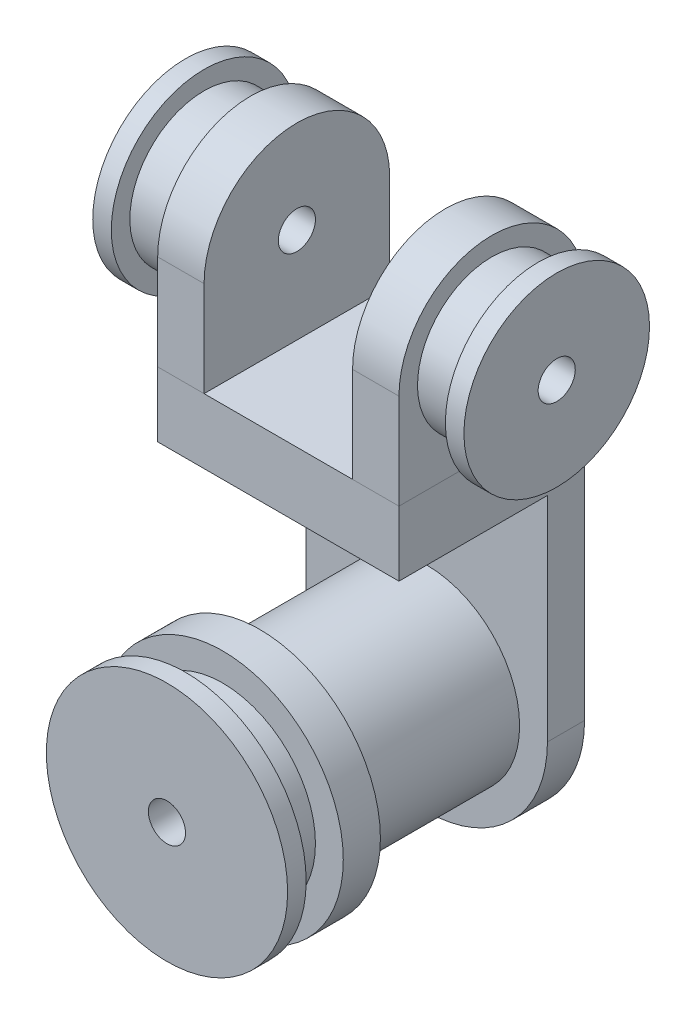
ISO-10303-21;
HEADER;
FILE_DESCRIPTION(('STEP AP214'),'2;1');
FILE_NAME('part.step','',(''),(''),'','','');
FILE_SCHEMA(('AUTOMOTIVE_DESIGN { 1 0 10303 214 1 1 1 1 }'));
ENDSEC;
DATA;
#1=APPLICATION_CONTEXT('core data for automotive mechanical design processes');
#2=APPLICATION_PROTOCOL_DEFINITION('international standard','automotive_design',2000,#1);
#3=PRODUCT_CONTEXT('',#1,'mechanical');
#4=PRODUCT('Part','Part','',(#3));
#5=PRODUCT_RELATED_PRODUCT_CATEGORY('part','',(#4));
#6=PRODUCT_DEFINITION_FORMATION('','',#4);
#7=PRODUCT_DEFINITION_CONTEXT('part definition',#1,'design');
#8=PRODUCT_DEFINITION('design','',#6,#7);
#9=PRODUCT_DEFINITION_SHAPE('','',#8);
#10=(LENGTH_UNIT() NAMED_UNIT(*) SI_UNIT(.MILLI.,.METRE.));
#11=(NAMED_UNIT(*) PLANE_ANGLE_UNIT() SI_UNIT($,.RADIAN.));
#12=(NAMED_UNIT(*) SI_UNIT($,.STERADIAN.) SOLID_ANGLE_UNIT());
#13=UNCERTAINTY_MEASURE_WITH_UNIT(LENGTH_MEASURE(1.E-05),#10,'distance_accuracy_value','');
#14=(GEOMETRIC_REPRESENTATION_CONTEXT(3) GLOBAL_UNCERTAINTY_ASSIGNED_CONTEXT((#13)) GLOBAL_UNIT_ASSIGNED_CONTEXT((#10,
#11,#12)) REPRESENTATION_CONTEXT('',''));
#15=CARTESIAN_POINT('',(0.,0.,0.));
#16=DIRECTION('',(0.,0.,1.));
#17=DIRECTION('',(1.,0.,0.));
#18=AXIS2_PLACEMENT_3D('',#15,#16,#17);
#19=CARTESIAN_POINT('',(-6.5,0.,0.));
#20=DIRECTION('',(-1.,0.,0.));
#21=DIRECTION('',(0.,1.,0.));
#22=AXIS2_PLACEMENT_3D('',#19,#20,#21);
#23=PLANE('',#22);
#24=DIRECTION('',(0.,1.,0.));
#25=VECTOR('',#24,1.);
#26=CARTESIAN_POINT('',(-6.5,0.,9.99999999999999));
#27=LINE('',#26,#25);
#28=CARTESIAN_POINT('',(-6.5,15.,10.));
#29=VERTEX_POINT('',#28);
#30=CARTESIAN_POINT('',(-6.5,20.1325517756622,10.));
#31=VERTEX_POINT('',#30);
#32=EDGE_CURVE('E115',#29,#31,#27,.T.);
#33=ORIENTED_EDGE('',*,*,#32,.T.);
#34=CARTESIAN_POINT('',(-6.5,20.1325517756622,5.));
#35=DIRECTION('',(1.,0.,0.));
#36=DIRECTION('',(0.,1.,0.));
#37=AXIS2_PLACEMENT_3D('',#34,#35,#36);
#38=CIRCLE('',#37,5.);
#39=CARTESIAN_POINT('',(-6.5,20.1325517756622,0.));
#40=VERTEX_POINT('',#39);
#41=EDGE_CURVE('E122',#40,#31,#38,.T.);
#42=ORIENTED_EDGE('',*,*,#41,.F.);
#43=DIRECTION('',(0.,1.,0.));
#44=VECTOR('',#43,1.);
#45=CARTESIAN_POINT('',(-6.5,0.,0.));
#46=LINE('',#45,#44);
#47=CARTESIAN_POINT('',(-6.5,15.,0.));
#48=VERTEX_POINT('',#47);
#49=EDGE_CURVE('E120',#48,#40,#46,.T.);
#50=ORIENTED_EDGE('',*,*,#49,.F.);
#51=DIRECTION('',(0.,0.,1.));
#52=VECTOR('',#51,1.);
#53=CARTESIAN_POINT('',(-6.5,15.,0.));
#54=LINE('',#53,#52);
#55=EDGE_CURVE('E104',#48,#29,#54,.T.);
#56=ORIENTED_EDGE('',*,*,#55,.T.);
#57=EDGE_LOOP('',(#33,#42,#50,#56));
#58=FACE_BOUND('',#57,.T.);
#59=CARTESIAN_POINT('',(-6.5,20.1325517756622,5.));
#60=DIRECTION('',(1.,0.,0.));
#61=DIRECTION('',(0.,1.,0.));
#62=AXIS2_PLACEMENT_3D('',#59,#60,#61);
#63=CIRCLE('',#62,4.);
#64=CARTESIAN_POINT('',(-6.5,24.1325517756622,5.));
#65=VERTEX_POINT('',#64);
#66=EDGE_CURVE('E126',#65,#65,#63,.T.);
#67=ORIENTED_EDGE('',*,*,#66,.T.);
#68=EDGE_LOOP('',(#67));
#69=FACE_BOUND('',#68,.T.);
#70=ADVANCED_FACE('F47',(#58,#69),#23,.T.);
#71=CARTESIAN_POINT('',(-4.,0.,9.99999999999999));
#72=DIRECTION('',(0.,0.,-1.));
#73=DIRECTION('',(0.,1.,0.));
#74=AXIS2_PLACEMENT_3D('',#71,#72,#73);
#75=PLANE('',#74);
#76=ORIENTED_EDGE('',*,*,#32,.F.);
#77=DIRECTION('',(-1.,0.,0.));
#78=VECTOR('',#77,1.);
#79=CARTESIAN_POINT('',(-4.,15.,10.));
#80=LINE('',#79,#78);
#81=CARTESIAN_POINT('',(-4.,15.,10.));
#82=VERTEX_POINT('',#81);
#83=EDGE_CURVE('E51',#82,#29,#80,.T.);
#84=ORIENTED_EDGE('',*,*,#83,.F.);
#85=DIRECTION('',(0.,1.,0.));
#86=VECTOR('',#85,1.);
#87=CARTESIAN_POINT('',(-4.,0.,9.99999999999999));
#88=LINE('',#87,#86);
#89=CARTESIAN_POINT('',(-4.,20.1325517756622,10.));
#90=VERTEX_POINT('',#89);
#91=EDGE_CURVE('E97',#82,#90,#88,.T.);
#92=ORIENTED_EDGE('',*,*,#91,.T.);
#93=DIRECTION('',(-1.,0.,0.));
#94=VECTOR('',#93,1.);
#95=CARTESIAN_POINT('',(-4.,20.1325517756622,10.));
#96=LINE('',#95,#94);
#97=EDGE_CURVE('E12',#90,#31,#96,.T.);
#98=ORIENTED_EDGE('',*,*,#97,.T.);
#99=EDGE_LOOP('',(#76,#84,#92,#98));
#100=FACE_BOUND('',#99,.T.);
#101=ADVANCED_FACE('F49',(#100),#75,.F.);
#102=CARTESIAN_POINT('',(-4.,20.1325517756622,5.));
#103=DIRECTION('',(-1.,0.,0.));
#104=DIRECTION('',(0.,1.,0.));
#105=AXIS2_PLACEMENT_3D('',#102,#103,#104);
#106=CYLINDRICAL_SURFACE('',#105,5.);
#107=ORIENTED_EDGE('',*,*,#41,.T.);
#108=ORIENTED_EDGE('',*,*,#97,.F.);
#109=CARTESIAN_POINT('',(-4.,20.1325517756622,5.));
#110=DIRECTION('',(1.,0.,0.));
#111=DIRECTION('',(0.,1.,0.));
#112=AXIS2_PLACEMENT_3D('',#109,#110,#111);
#113=CIRCLE('',#112,5.);
#114=CARTESIAN_POINT('',(-4.,20.1325517756622,0.));
#115=VERTEX_POINT('',#114);
#116=EDGE_CURVE('E66',#115,#90,#113,.T.);
#117=ORIENTED_EDGE('',*,*,#116,.F.);
#118=DIRECTION('',(-1.,0.,0.));
#119=VECTOR('',#118,1.);
#120=CARTESIAN_POINT('',(-4.,20.1325517756622,0.));
#121=LINE('',#120,#119);
#122=EDGE_CURVE('E57',#115,#40,#121,.T.);
#123=ORIENTED_EDGE('',*,*,#122,.T.);
#124=EDGE_LOOP('',(#107,#108,#117,#123));
#125=FACE_BOUND('',#124,.T.);
#126=ADVANCED_FACE('F160',(#125),#106,.T.);
#127=CARTESIAN_POINT('',(-4.,0.,0.));
#128=DIRECTION('',(0.,0.,-1.));
#129=DIRECTION('',(0.,1.,0.));
#130=AXIS2_PLACEMENT_3D('',#127,#128,#129);
#131=PLANE('',#130);
#132=ORIENTED_EDGE('',*,*,#49,.T.);
#133=ORIENTED_EDGE('',*,*,#122,.F.);
#134=DIRECTION('',(0.,1.,0.));
#135=VECTOR('',#134,1.);
#136=CARTESIAN_POINT('',(-4.,0.,0.));
#137=LINE('',#136,#135);
#138=CARTESIAN_POINT('',(-4.,15.,0.));
#139=VERTEX_POINT('',#138);
#140=EDGE_CURVE('E96',#139,#115,#137,.T.);
#141=ORIENTED_EDGE('',*,*,#140,.F.);
#142=DIRECTION('',(-1.,0.,0.));
#143=VECTOR('',#142,1.);
#144=CARTESIAN_POINT('',(-4.,15.,0.));
#145=LINE('',#144,#143);
#146=EDGE_CURVE('E101',#139,#48,#145,.T.);
#147=ORIENTED_EDGE('',*,*,#146,.T.);
#148=EDGE_LOOP('',(#132,#133,#141,#147));
#149=FACE_BOUND('',#148,.T.);
#150=ADVANCED_FACE('F107',(#149),#131,.T.);
#151=CARTESIAN_POINT('',(-4.,15.,0.));
#152=DIRECTION('',(0.,1.,0.));
#153=DIRECTION('',(1.,0.,0.));
#154=AXIS2_PLACEMENT_3D('',#151,#152,#153);
#155=PLANE('',#154);
#156=ORIENTED_EDGE('',*,*,#55,.F.);
#157=ORIENTED_EDGE('',*,*,#146,.F.);
#158=DIRECTION('',(0.,0.,1.));
#159=VECTOR('',#158,1.);
#160=CARTESIAN_POINT('',(-4.,15.,0.));
#161=LINE('',#160,#159);
#162=EDGE_CURVE('E92',#139,#82,#161,.T.);
#163=ORIENTED_EDGE('',*,*,#162,.T.);
#164=ORIENTED_EDGE('',*,*,#83,.T.);
#165=EDGE_LOOP('',(#156,#157,#163,#164));
#166=FACE_BOUND('',#165,.T.);
#167=ADVANCED_FACE('F102',(#166),#155,.F.);
#168=CARTESIAN_POINT('',(-4.,20.1325517756622,5.));
#169=DIRECTION('',(-1.,0.,0.));
#170=DIRECTION('',(0.,1.,0.));
#171=AXIS2_PLACEMENT_3D('',#168,#169,#170);
#172=CYLINDRICAL_SURFACE('',#171,1.);
#173=CARTESIAN_POINT('',(-4.,20.1325517756622,5.));
#174=DIRECTION('',(1.,0.,0.));
#175=DIRECTION('',(0.,1.,0.));
#176=AXIS2_PLACEMENT_3D('',#173,#174,#175);
#177=CIRCLE('',#176,1.);
#178=CARTESIAN_POINT('',(-4.,21.1325517756622,5.));
#179=VERTEX_POINT('',#178);
#180=EDGE_CURVE('E109',#179,#179,#177,.T.);
#181=ORIENTED_EDGE('',*,*,#180,.T.);
#182=EDGE_LOOP('',(#181));
#183=FACE_BOUND('',#182,.T.);
#184=CARTESIAN_POINT('',(-10.,20.1325517756622,5.));
#185=DIRECTION('',(1.,0.,0.));
#186=DIRECTION('',(0.,1.,0.));
#187=AXIS2_PLACEMENT_3D('',#184,#185,#186);
#188=CIRCLE('',#187,1.);
#189=CARTESIAN_POINT('',(-10.,21.1325517756622,5.));
#190=VERTEX_POINT('',#189);
#191=EDGE_CURVE('E135',#190,#190,#188,.T.);
#192=ORIENTED_EDGE('',*,*,#191,.F.);
#193=EDGE_LOOP('',(#192));
#194=FACE_BOUND('',#193,.T.);
#195=ADVANCED_FACE('F143',(#183,#194),#172,.F.);
#196=CARTESIAN_POINT('',(-4.,0.,0.));
#197=DIRECTION('',(-1.,0.,0.));
#198=DIRECTION('',(0.,1.,0.));
#199=AXIS2_PLACEMENT_3D('',#196,#197,#198);
#200=PLANE('',#199);
#201=ORIENTED_EDGE('',*,*,#91,.F.);
#202=ORIENTED_EDGE('',*,*,#162,.F.);
#203=ORIENTED_EDGE('',*,*,#140,.T.);
#204=ORIENTED_EDGE('',*,*,#116,.T.);
#205=EDGE_LOOP('',(#201,#202,#203,#204));
#206=FACE_BOUND('',#205,.T.);
#207=ORIENTED_EDGE('',*,*,#180,.F.);
#208=EDGE_LOOP('',(#207));
#209=FACE_BOUND('',#208,.T.);
#210=ADVANCED_FACE('F93',(#206,#209),#200,.F.);
#211=CARTESIAN_POINT('',(-9.,20.1325517756622,5.));
#212=DIRECTION('',(1.,0.,0.));
#213=DIRECTION('',(0.,-1.,0.));
#214=AXIS2_PLACEMENT_3D('',#211,#212,#213);
#215=CYLINDRICAL_SURFACE('',#214,4.);
#216=CARTESIAN_POINT('',(-9.,20.1325517756622,5.));
#217=DIRECTION('',(1.,0.,0.));
#218=DIRECTION('',(0.,1.,0.));
#219=AXIS2_PLACEMENT_3D('',#216,#217,#218);
#220=CIRCLE('',#219,4.);
#221=CARTESIAN_POINT('',(-9.,24.1325517756622,5.));
#222=VERTEX_POINT('',#221);
#223=EDGE_CURVE('E118',#222,#222,#220,.T.);
#224=ORIENTED_EDGE('',*,*,#223,.T.);
#225=EDGE_LOOP('',(#224));
#226=FACE_BOUND('',#225,.T.);
#227=ORIENTED_EDGE('',*,*,#66,.F.);
#228=EDGE_LOOP('',(#227));
#229=FACE_BOUND('',#228,.T.);
#230=ADVANCED_FACE('F151',(#226,#229),#215,.T.);
#231=CARTESIAN_POINT('',(-10.,20.1325517756622,5.));
#232=DIRECTION('',(-1.,0.,0.));
#233=DIRECTION('',(0.,1.,0.));
#234=AXIS2_PLACEMENT_3D('',#231,#232,#233);
#235=PLANE('',#234);
#236=CARTESIAN_POINT('',(-10.,20.1325517756622,5.));
#237=DIRECTION('',(1.,0.,0.));
#238=DIRECTION('',(0.,1.,0.));
#239=AXIS2_PLACEMENT_3D('',#236,#237,#238);
#240=CIRCLE('',#239,5.);
#241=CARTESIAN_POINT('',(-10.,25.1325517756622,5.));
#242=VERTEX_POINT('',#241);
#243=EDGE_CURVE('E129',#242,#242,#240,.T.);
#244=ORIENTED_EDGE('',*,*,#243,.F.);
#245=EDGE_LOOP('',(#244));
#246=FACE_BOUND('',#245,.T.);
#247=ORIENTED_EDGE('',*,*,#191,.T.);
#248=EDGE_LOOP('',(#247));
#249=FACE_BOUND('',#248,.T.);
#250=ADVANCED_FACE('F141',(#246,#249),#235,.T.);
#251=CARTESIAN_POINT('',(-9.,20.1325517756622,5.));
#252=DIRECTION('',(-1.,0.,0.));
#253=DIRECTION('',(0.,1.,0.));
#254=AXIS2_PLACEMENT_3D('',#251,#252,#253);
#255=PLANE('',#254);
#256=ORIENTED_EDGE('',*,*,#223,.F.);
#257=EDGE_LOOP('',(#256));
#258=FACE_BOUND('',#257,.T.);
#259=CARTESIAN_POINT('',(-9.,20.1325517756622,5.));
#260=DIRECTION('',(1.,0.,0.));
#261=DIRECTION('',(0.,1.,0.));
#262=AXIS2_PLACEMENT_3D('',#259,#260,#261);
#263=CIRCLE('',#262,5.);
#264=CARTESIAN_POINT('',(-9.,25.1325517756622,5.));
#265=VERTEX_POINT('',#264);
#266=EDGE_CURVE('E132',#265,#265,#263,.T.);
#267=ORIENTED_EDGE('',*,*,#266,.T.);
#268=EDGE_LOOP('',(#267));
#269=FACE_BOUND('',#268,.T.);
#270=ADVANCED_FACE('F169',(#258,#269),#255,.F.);
#271=CARTESIAN_POINT('',(-10.,20.1325517756622,5.));
#272=DIRECTION('',(1.,0.,0.));
#273=DIRECTION('',(0.,-1.,0.));
#274=AXIS2_PLACEMENT_3D('',#271,#272,#273);
#275=CYLINDRICAL_SURFACE('',#274,5.);
#276=ORIENTED_EDGE('',*,*,#243,.T.);
#277=EDGE_LOOP('',(#276));
#278=FACE_BOUND('',#277,.T.);
#279=ORIENTED_EDGE('',*,*,#266,.F.);
#280=EDGE_LOOP('',(#279));
#281=FACE_BOUND('',#280,.T.);
#282=ADVANCED_FACE('F166',(#278,#281),#275,.T.);
#283=CLOSED_SHELL('',(#70,#101,#126,#150,#167,#195,#210,#230,#250,#270,#282));
#284=MANIFOLD_SOLID_BREP('B2',#283);
#285=CARTESIAN_POINT('',(6.5,0.,0.));
#286=DIRECTION('',(1.,0.,0.));
#287=DIRECTION('',(0.,1.,0.));
#288=AXIS2_PLACEMENT_3D('',#285,#286,#287);
#289=PLANE('',#288);
#290=DIRECTION('',(0.,1.,0.));
#291=VECTOR('',#290,1.);
#292=CARTESIAN_POINT('',(6.5,0.,9.99999999999999));
#293=LINE('',#292,#291);
#294=CARTESIAN_POINT('',(6.5,15.,10.));
#295=VERTEX_POINT('',#294);
#296=CARTESIAN_POINT('',(6.5,20.1325517756622,10.));
#297=VERTEX_POINT('',#296);
#298=EDGE_CURVE('E333',#295,#297,#293,.T.);
#299=ORIENTED_EDGE('',*,*,#298,.F.);
#300=DIRECTION('',(0.,0.,1.));
#301=VECTOR('',#300,1.);
#302=CARTESIAN_POINT('',(6.5,15.,0.));
#303=LINE('',#302,#301);
#304=CARTESIAN_POINT('',(6.5,15.,0.));
#305=VERTEX_POINT('',#304);
#306=EDGE_CURVE('E335',#305,#295,#303,.T.);
#307=ORIENTED_EDGE('',*,*,#306,.F.);
#308=DIRECTION('',(0.,1.,0.));
#309=VECTOR('',#308,1.);
#310=CARTESIAN_POINT('',(6.5,0.,0.));
#311=LINE('',#310,#309);
#312=CARTESIAN_POINT('',(6.5,20.1325517756622,0.));
#313=VERTEX_POINT('',#312);
#314=EDGE_CURVE('E317',#305,#313,#311,.T.);
#315=ORIENTED_EDGE('',*,*,#314,.T.);
#316=CARTESIAN_POINT('',(6.5,20.1325517756622,5.));
#317=DIRECTION('',(1.,0.,0.));
#318=DIRECTION('',(0.,1.,0.));
#319=AXIS2_PLACEMENT_3D('',#316,#317,#318);
#320=CIRCLE('',#319,5.);
#321=EDGE_CURVE('E339',#313,#297,#320,.T.);
#322=ORIENTED_EDGE('',*,*,#321,.T.);
#323=EDGE_LOOP('',(#299,#307,#315,#322));
#324=FACE_BOUND('',#323,.T.);
#325=CARTESIAN_POINT('',(6.5,20.1325517756622,5.));
#326=DIRECTION('',(1.,0.,0.));
#327=DIRECTION('',(0.,1.,0.));
#328=AXIS2_PLACEMENT_3D('',#325,#326,#327);
#329=CIRCLE('',#328,4.);
#330=CARTESIAN_POINT('',(6.5,24.1325517756622,5.));
#331=VERTEX_POINT('',#330);
#332=EDGE_CURVE('E345',#331,#331,#329,.T.);
#333=ORIENTED_EDGE('',*,*,#332,.F.);
#334=EDGE_LOOP('',(#333));
#335=FACE_BOUND('',#334,.T.);
#336=ADVANCED_FACE('F266',(#324,#335),#289,.T.);
#337=CARTESIAN_POINT('',(4.,0.,9.99999999999999));
#338=DIRECTION('',(0.,0.,-1.));
#339=DIRECTION('',(0.,1.,0.));
#340=AXIS2_PLACEMENT_3D('',#337,#338,#339);
#341=PLANE('',#340);
#342=ORIENTED_EDGE('',*,*,#298,.T.);
#343=DIRECTION('',(1.,0.,0.));
#344=VECTOR('',#343,1.);
#345=CARTESIAN_POINT('',(4.,20.1325517756622,10.));
#346=LINE('',#345,#344);
#347=CARTESIAN_POINT('',(4.,20.1325517756622,10.));
#348=VERTEX_POINT('',#347);
#349=EDGE_CURVE('E45',#348,#297,#346,.T.);
#350=ORIENTED_EDGE('',*,*,#349,.F.);
#351=DIRECTION('',(0.,1.,0.));
#352=VECTOR('',#351,1.);
#353=CARTESIAN_POINT('',(4.,0.,9.99999999999999));
#354=LINE('',#353,#352);
#355=CARTESIAN_POINT('',(4.,15.,10.));
#356=VERTEX_POINT('',#355);
#357=EDGE_CURVE('E285',#356,#348,#354,.T.);
#358=ORIENTED_EDGE('',*,*,#357,.F.);
#359=DIRECTION('',(1.,0.,0.));
#360=VECTOR('',#359,1.);
#361=CARTESIAN_POINT('',(4.,15.,10.));
#362=LINE('',#361,#360);
#363=EDGE_CURVE('E270',#356,#295,#362,.T.);
#364=ORIENTED_EDGE('',*,*,#363,.T.);
#365=EDGE_LOOP('',(#342,#350,#358,#364));
#366=FACE_BOUND('',#365,.T.);
#367=ADVANCED_FACE('F268',(#366),#341,.F.);
#368=CARTESIAN_POINT('',(4.,20.1325517756622,5.));
#369=DIRECTION('',(1.,0.,0.));
#370=DIRECTION('',(0.,1.,0.));
#371=AXIS2_PLACEMENT_3D('',#368,#369,#370);
#372=CYLINDRICAL_SURFACE('',#371,5.);
#373=ORIENTED_EDGE('',*,*,#321,.F.);
#374=DIRECTION('',(1.,0.,0.));
#375=VECTOR('',#374,1.);
#376=CARTESIAN_POINT('',(4.,20.1325517756622,0.));
#377=LINE('',#376,#375);
#378=CARTESIAN_POINT('',(4.,20.1325517756622,0.));
#379=VERTEX_POINT('',#378);
#380=EDGE_CURVE('E276',#379,#313,#377,.T.);
#381=ORIENTED_EDGE('',*,*,#380,.F.);
#382=CARTESIAN_POINT('',(4.,20.1325517756622,5.));
#383=DIRECTION('',(1.,0.,0.));
#384=DIRECTION('',(0.,1.,0.));
#385=AXIS2_PLACEMENT_3D('',#382,#383,#384);
#386=CIRCLE('',#385,5.);
#387=EDGE_CURVE('E325',#379,#348,#386,.T.);
#388=ORIENTED_EDGE('',*,*,#387,.T.);
#389=ORIENTED_EDGE('',*,*,#349,.T.);
#390=EDGE_LOOP('',(#373,#381,#388,#389));
#391=FACE_BOUND('',#390,.T.);
#392=ADVANCED_FACE('F382',(#391),#372,.T.);
#393=CARTESIAN_POINT('',(4.,0.,0.));
#394=DIRECTION('',(0.,0.,-1.));
#395=DIRECTION('',(0.,1.,0.));
#396=AXIS2_PLACEMENT_3D('',#393,#394,#395);
#397=PLANE('',#396);
#398=ORIENTED_EDGE('',*,*,#314,.F.);
#399=DIRECTION('',(1.,0.,0.));
#400=VECTOR('',#399,1.);
#401=CARTESIAN_POINT('',(4.,15.,0.));
#402=LINE('',#401,#400);
#403=CARTESIAN_POINT('',(4.,15.,0.));
#404=VERTEX_POINT('',#403);
#405=EDGE_CURVE('E314',#404,#305,#402,.T.);
#406=ORIENTED_EDGE('',*,*,#405,.F.);
#407=DIRECTION('',(0.,1.,0.));
#408=VECTOR('',#407,1.);
#409=CARTESIAN_POINT('',(4.,0.,0.));
#410=LINE('',#409,#408);
#411=EDGE_CURVE('E316',#404,#379,#410,.T.);
#412=ORIENTED_EDGE('',*,*,#411,.T.);
#413=ORIENTED_EDGE('',*,*,#380,.T.);
#414=EDGE_LOOP('',(#398,#406,#412,#413));
#415=FACE_BOUND('',#414,.T.);
#416=ADVANCED_FACE('F315',(#415),#397,.T.);
#417=CARTESIAN_POINT('',(4.,15.,0.));
#418=DIRECTION('',(0.,1.,0.));
#419=DIRECTION('',(-1.,0.,0.));
#420=AXIS2_PLACEMENT_3D('',#417,#418,#419);
#421=PLANE('',#420);
#422=ORIENTED_EDGE('',*,*,#306,.T.);
#423=ORIENTED_EDGE('',*,*,#363,.F.);
#424=DIRECTION('',(0.,0.,1.));
#425=VECTOR('',#424,1.);
#426=CARTESIAN_POINT('',(4.,15.,0.));
#427=LINE('',#426,#425);
#428=EDGE_CURVE('E311',#404,#356,#427,.T.);
#429=ORIENTED_EDGE('',*,*,#428,.F.);
#430=ORIENTED_EDGE('',*,*,#405,.T.);
#431=EDGE_LOOP('',(#422,#423,#429,#430));
#432=FACE_BOUND('',#431,.T.);
#433=ADVANCED_FACE('F320',(#432),#421,.F.);
#434=CARTESIAN_POINT('',(4.,20.1325517756622,5.));
#435=DIRECTION('',(1.,0.,0.));
#436=DIRECTION('',(0.,1.,0.));
#437=AXIS2_PLACEMENT_3D('',#434,#435,#436);
#438=CYLINDRICAL_SURFACE('',#437,1.);
#439=CARTESIAN_POINT('',(4.,20.1325517756622,5.));
#440=DIRECTION('',(1.,0.,0.));
#441=DIRECTION('',(0.,1.,0.));
#442=AXIS2_PLACEMENT_3D('',#439,#440,#441);
#443=CIRCLE('',#442,1.);
#444=CARTESIAN_POINT('',(4.,21.1325517756622,5.));
#445=VERTEX_POINT('',#444);
#446=EDGE_CURVE('E327',#445,#445,#443,.T.);
#447=ORIENTED_EDGE('',*,*,#446,.F.);
#448=EDGE_LOOP('',(#447));
#449=FACE_BOUND('',#448,.T.);
#450=CARTESIAN_POINT('',(10.,20.1325517756622,5.));
#451=DIRECTION('',(1.,0.,0.));
#452=DIRECTION('',(0.,1.,0.));
#453=AXIS2_PLACEMENT_3D('',#450,#451,#452);
#454=CIRCLE('',#453,1.);
#455=CARTESIAN_POINT('',(10.,21.1325517756622,5.));
#456=VERTEX_POINT('',#455);
#457=EDGE_CURVE('E354',#456,#456,#454,.T.);
#458=ORIENTED_EDGE('',*,*,#457,.T.);
#459=EDGE_LOOP('',(#458));
#460=FACE_BOUND('',#459,.T.);
#461=ADVANCED_FACE('F360',(#449,#460),#438,.F.);
#462=CARTESIAN_POINT('',(4.,0.,0.));
#463=DIRECTION('',(1.,0.,0.));
#464=DIRECTION('',(0.,1.,0.));
#465=AXIS2_PLACEMENT_3D('',#462,#463,#464);
#466=PLANE('',#465);
#467=ORIENTED_EDGE('',*,*,#357,.T.);
#468=ORIENTED_EDGE('',*,*,#387,.F.);
#469=ORIENTED_EDGE('',*,*,#411,.F.);
#470=ORIENTED_EDGE('',*,*,#428,.T.);
#471=EDGE_LOOP('',(#467,#468,#469,#470));
#472=FACE_BOUND('',#471,.T.);
#473=ORIENTED_EDGE('',*,*,#446,.T.);
#474=EDGE_LOOP('',(#473));
#475=FACE_BOUND('',#474,.T.);
#476=ADVANCED_FACE('F323',(#472,#475),#466,.F.);
#477=CARTESIAN_POINT('',(9.,20.1325517756622,5.));
#478=DIRECTION('',(-1.,0.,0.));
#479=DIRECTION('',(0.,-1.,0.));
#480=AXIS2_PLACEMENT_3D('',#477,#478,#479);
#481=CYLINDRICAL_SURFACE('',#480,4.);
#482=CARTESIAN_POINT('',(9.,20.1325517756622,5.));
#483=DIRECTION('',(1.,0.,0.));
#484=DIRECTION('',(0.,1.,0.));
#485=AXIS2_PLACEMENT_3D('',#482,#483,#484);
#486=CIRCLE('',#485,4.);
#487=CARTESIAN_POINT('',(9.,24.1325517756622,5.));
#488=VERTEX_POINT('',#487);
#489=EDGE_CURVE('E336',#488,#488,#486,.T.);
#490=ORIENTED_EDGE('',*,*,#489,.F.);
#491=EDGE_LOOP('',(#490));
#492=FACE_BOUND('',#491,.T.);
#493=ORIENTED_EDGE('',*,*,#332,.T.);
#494=EDGE_LOOP('',(#493));
#495=FACE_BOUND('',#494,.T.);
#496=ADVANCED_FACE('F365',(#492,#495),#481,.T.);
#497=CARTESIAN_POINT('',(10.,20.1325517756622,5.));
#498=DIRECTION('',(1.,0.,0.));
#499=DIRECTION('',(0.,1.,0.));
#500=AXIS2_PLACEMENT_3D('',#497,#498,#499);
#501=PLANE('',#500);
#502=CARTESIAN_POINT('',(10.,20.1325517756622,5.));
#503=DIRECTION('',(1.,0.,0.));
#504=DIRECTION('',(0.,1.,0.));
#505=AXIS2_PLACEMENT_3D('',#502,#503,#504);
#506=CIRCLE('',#505,5.);
#507=CARTESIAN_POINT('',(10.,25.1325517756622,5.));
#508=VERTEX_POINT('',#507);
#509=EDGE_CURVE('E348',#508,#508,#506,.T.);
#510=ORIENTED_EDGE('',*,*,#509,.T.);
#511=EDGE_LOOP('',(#510));
#512=FACE_BOUND('',#511,.T.);
#513=ORIENTED_EDGE('',*,*,#457,.F.);
#514=EDGE_LOOP('',(#513));
#515=FACE_BOUND('',#514,.T.);
#516=ADVANCED_FACE('F362',(#512,#515),#501,.T.);
#517=CARTESIAN_POINT('',(9.,20.1325517756622,5.));
#518=DIRECTION('',(1.,0.,0.));
#519=DIRECTION('',(0.,1.,0.));
#520=AXIS2_PLACEMENT_3D('',#517,#518,#519);
#521=PLANE('',#520);
#522=ORIENTED_EDGE('',*,*,#489,.T.);
#523=EDGE_LOOP('',(#522));
#524=FACE_BOUND('',#523,.T.);
#525=CARTESIAN_POINT('',(9.,20.1325517756622,5.));
#526=DIRECTION('',(1.,0.,0.));
#527=DIRECTION('',(0.,1.,0.));
#528=AXIS2_PLACEMENT_3D('',#525,#526,#527);
#529=CIRCLE('',#528,5.);
#530=CARTESIAN_POINT('',(9.,25.1325517756622,5.));
#531=VERTEX_POINT('',#530);
#532=EDGE_CURVE('E351',#531,#531,#529,.T.);
#533=ORIENTED_EDGE('',*,*,#532,.F.);
#534=EDGE_LOOP('',(#533));
#535=FACE_BOUND('',#534,.T.);
#536=ADVANCED_FACE('F364',(#524,#535),#521,.F.);
#537=CARTESIAN_POINT('',(10.,20.1325517756622,5.));
#538=DIRECTION('',(-1.,0.,0.));
#539=DIRECTION('',(0.,-1.,0.));
#540=AXIS2_PLACEMENT_3D('',#537,#538,#539);
#541=CYLINDRICAL_SURFACE('',#540,5.);
#542=ORIENTED_EDGE('',*,*,#509,.F.);
#543=EDGE_LOOP('',(#542));
#544=FACE_BOUND('',#543,.T.);
#545=ORIENTED_EDGE('',*,*,#532,.T.);
#546=EDGE_LOOP('',(#545));
#547=FACE_BOUND('',#546,.T.);
#548=ADVANCED_FACE('F372',(#544,#547),#541,.T.);
#549=CLOSED_SHELL('',(#336,#367,#392,#416,#433,#461,#476,#496,#516,#536,#548));
#550=MANIFOLD_SOLID_BREP('B6',#549);
#551=CARTESIAN_POINT('',(0.,0.,15.));
#552=DIRECTION('',(0.,0.,-1.));
#553=DIRECTION('',(-1.,0.,0.));
#554=AXIS2_PLACEMENT_3D('',#551,#552,#553);
#555=CYLINDRICAL_SURFACE('',#554,5.);
#556=CARTESIAN_POINT('',(0.,0.,11.));
#557=DIRECTION('',(0.,0.,1.));
#558=DIRECTION('',(1.,0.,0.));
#559=AXIS2_PLACEMENT_3D('',#556,#557,#558);
#560=CIRCLE('',#559,5.);
#561=CARTESIAN_POINT('',(5.,0.,11.));
#562=VERTEX_POINT('',#561);
#563=EDGE_CURVE('E486',#562,#562,#560,.T.);
#564=ORIENTED_EDGE('',*,*,#563,.F.);
#565=EDGE_LOOP('',(#564));
#566=FACE_BOUND('',#565,.T.);
#567=CARTESIAN_POINT('',(0.,0.,2.));
#568=DIRECTION('',(0.,0.,-1.));
#569=DIRECTION('',(-1.,0.,0.));
#570=AXIS2_PLACEMENT_3D('',#567,#568,#569);
#571=CIRCLE('',#570,5.);
#572=CARTESIAN_POINT('',(-5.,0.,2.));
#573=VERTEX_POINT('',#572);
#574=EDGE_CURVE('E264',#573,#573,#571,.T.);
#575=ORIENTED_EDGE('',*,*,#574,.F.);
#576=EDGE_LOOP('',(#575));
#577=FACE_BOUND('',#576,.T.);
#578=ADVANCED_FACE('F476',(#566,#577),#555,.T.);
#579=CARTESIAN_POINT('',(0.,0.,0.));
#580=DIRECTION('',(0.,0.,1.));
#581=DIRECTION('',(1.,0.,0.));
#582=AXIS2_PLACEMENT_3D('',#579,#580,#581);
#583=PLANE('',#582);
#584=CARTESIAN_POINT('',(0.,0.,0.));
#585=DIRECTION('',(0.,0.,1.));
#586=DIRECTION('',(1.,0.,0.));
#587=AXIS2_PLACEMENT_3D('',#584,#585,#586);
#588=CIRCLE('',#587,1.);
#589=CARTESIAN_POINT('',(1.,0.,0.));
#590=VERTEX_POINT('',#589);
#591=EDGE_CURVE('E602',#590,#590,#588,.T.);
#592=ORIENTED_EDGE('',*,*,#591,.T.);
#593=EDGE_LOOP('',(#592));
#594=FACE_BOUND('',#593,.T.);
#595=DIRECTION('',(0.,1.,0.));
#596=VECTOR('',#595,1.);
#597=CARTESIAN_POINT('',(-6.5,0.,0.));
#598=LINE('',#597,#596);
#599=CARTESIAN_POINT('',(-6.5,0.,0.));
#600=VERTEX_POINT('',#599);
#601=CARTESIAN_POINT('',(-6.5,15.,0.));
#602=VERTEX_POINT('',#601);
#603=EDGE_CURVE('E578',#600,#602,#598,.T.);
#604=ORIENTED_EDGE('',*,*,#603,.T.);
#605=DIRECTION('',(1.,0.,0.));
#606=VECTOR('',#605,1.);
#607=CARTESIAN_POINT('',(6.5,15.,0.));
#608=LINE('',#607,#606);
#609=CARTESIAN_POINT('',(6.5,15.,0.));
#610=VERTEX_POINT('',#609);
#611=EDGE_CURVE('E555',#602,#610,#608,.T.);
#612=ORIENTED_EDGE('',*,*,#611,.T.);
#613=DIRECTION('',(0.,-1.,0.));
#614=VECTOR('',#613,1.);
#615=CARTESIAN_POINT('',(6.5,13.,0.));
#616=LINE('',#615,#614);
#617=CARTESIAN_POINT('',(6.5,0.,0.));
#618=VERTEX_POINT('',#617);
#619=EDGE_CURVE('E572',#610,#618,#616,.T.);
#620=ORIENTED_EDGE('',*,*,#619,.T.);
#621=CARTESIAN_POINT('',(0.,0.,0.));
#622=DIRECTION('',(0.,0.,-1.));
#623=DIRECTION('',(-1.,0.,0.));
#624=AXIS2_PLACEMENT_3D('',#621,#622,#623);
#625=CIRCLE('',#624,6.5);
#626=EDGE_CURVE('E568',#618,#600,#625,.T.);
#627=ORIENTED_EDGE('',*,*,#626,.T.);
#628=EDGE_LOOP('',(#604,#612,#620,#627));
#629=FACE_BOUND('',#628,.T.);
#630=ADVANCED_FACE('F614',(#594,#629),#583,.F.);
#631=CARTESIAN_POINT('',(0.,0.,13.));
#632=DIRECTION('',(0.,0.,1.));
#633=DIRECTION('',(1.,0.,0.));
#634=AXIS2_PLACEMENT_3D('',#631,#632,#633);
#635=CIRCLE('',#634,5.);
#636=CARTESIAN_POINT('',(5.,0.,13.));
#637=VERTEX_POINT('',#636);
#638=EDGE_CURVE('E597',#637,#637,#635,.T.);
#639=ORIENTED_EDGE('',*,*,#638,.T.);
#640=EDGE_LOOP('',(#639));
#641=FACE_BOUND('',#640,.T.);
#642=CARTESIAN_POINT('',(0.,0.,15.));
#643=DIRECTION('',(0.,0.,1.));
#644=DIRECTION('',(1.,0.,0.));
#645=AXIS2_PLACEMENT_3D('',#642,#643,#644);
#646=CIRCLE('',#645,5.);
#647=CARTESIAN_POINT('',(5.,0.,15.));
#648=VERTEX_POINT('',#647);
#649=EDGE_CURVE('E480',#648,#648,#646,.T.);
#650=ORIENTED_EDGE('',*,*,#649,.F.);
#651=EDGE_LOOP('',(#650));
#652=FACE_BOUND('',#651,.T.);
#653=ADVANCED_FACE('F478',(#641,#652),#555,.T.);
#654=CARTESIAN_POINT('',(0.,0.,15.));
#655=DIRECTION('',(0.,0.,-1.));
#656=DIRECTION('',(-1.,0.,0.));
#657=AXIS2_PLACEMENT_3D('',#654,#655,#656);
#658=CYLINDRICAL_SURFACE('',#657,1.);
#659=ORIENTED_EDGE('',*,*,#591,.F.);
#660=EDGE_LOOP('',(#659));
#661=FACE_BOUND('',#660,.T.);
#662=CARTESIAN_POINT('',(0.,0.,16.));
#663=DIRECTION('',(0.,0.,1.));
#664=DIRECTION('',(1.,0.,0.));
#665=AXIS2_PLACEMENT_3D('',#662,#663,#664);
#666=CIRCLE('',#665,1.);
#667=CARTESIAN_POINT('',(1.,0.,16.));
#668=VERTEX_POINT('',#667);
#669=EDGE_CURVE('E583',#668,#668,#666,.T.);
#670=ORIENTED_EDGE('',*,*,#669,.T.);
#671=EDGE_LOOP('',(#670));
#672=FACE_BOUND('',#671,.T.);
#673=ADVANCED_FACE('F613',(#661,#672),#658,.F.);
#674=CARTESIAN_POINT('',(0.,0.,11.));
#675=DIRECTION('',(0.,0.,1.));
#676=DIRECTION('',(1.,0.,0.));
#677=AXIS2_PLACEMENT_3D('',#674,#675,#676);
#678=PLANE('',#677);
#679=CARTESIAN_POINT('',(0.,0.,11.));
#680=DIRECTION('',(0.,0.,1.));
#681=DIRECTION('',(1.,0.,0.));
#682=AXIS2_PLACEMENT_3D('',#679,#680,#681);
#683=CIRCLE('',#682,6.5);
#684=CARTESIAN_POINT('',(6.5,0.,11.));
#685=VERTEX_POINT('',#684);
#686=EDGE_CURVE('E594',#685,#685,#683,.T.);
#687=ORIENTED_EDGE('',*,*,#686,.F.);
#688=EDGE_LOOP('',(#687));
#689=FACE_BOUND('',#688,.T.);
#690=ORIENTED_EDGE('',*,*,#563,.T.);
#691=EDGE_LOOP('',(#690));
#692=FACE_BOUND('',#691,.T.);
#693=ADVANCED_FACE('F620',(#689,#692),#678,.F.);
#694=CARTESIAN_POINT('',(0.,0.,13.));
#695=DIRECTION('',(0.,0.,1.));
#696=DIRECTION('',(1.,0.,0.));
#697=AXIS2_PLACEMENT_3D('',#694,#695,#696);
#698=PLANE('',#697);
#699=CARTESIAN_POINT('',(0.,0.,13.));
#700=DIRECTION('',(0.,0.,1.));
#701=DIRECTION('',(1.,0.,0.));
#702=AXIS2_PLACEMENT_3D('',#699,#700,#701);
#703=CIRCLE('',#702,6.5);
#704=CARTESIAN_POINT('',(6.5,0.,13.));
#705=VERTEX_POINT('',#704);
#706=EDGE_CURVE('E591',#705,#705,#703,.T.);
#707=ORIENTED_EDGE('',*,*,#706,.T.);
#708=EDGE_LOOP('',(#707));
#709=FACE_BOUND('',#708,.T.);
#710=ORIENTED_EDGE('',*,*,#638,.F.);
#711=EDGE_LOOP('',(#710));
#712=FACE_BOUND('',#711,.T.);
#713=ADVANCED_FACE('F663',(#709,#712),#698,.T.);
#714=CARTESIAN_POINT('',(0.,0.,11.));
#715=DIRECTION('',(0.,0.,1.));
#716=DIRECTION('',(1.,0.,0.));
#717=AXIS2_PLACEMENT_3D('',#714,#715,#716);
#718=CYLINDRICAL_SURFACE('',#717,6.5);
#719=ORIENTED_EDGE('',*,*,#686,.T.);
#720=EDGE_LOOP('',(#719));
#721=FACE_BOUND('',#720,.T.);
#722=ORIENTED_EDGE('',*,*,#706,.F.);
#723=EDGE_LOOP('',(#722));
#724=FACE_BOUND('',#723,.T.);
#725=ADVANCED_FACE('F658',(#721,#724),#718,.T.);
#726=CARTESIAN_POINT('',(0.,0.,15.));
#727=DIRECTION('',(0.,0.,1.));
#728=DIRECTION('',(1.,0.,0.));
#729=AXIS2_PLACEMENT_3D('',#726,#727,#728);
#730=PLANE('',#729);
#731=CARTESIAN_POINT('',(0.,0.,15.));
#732=DIRECTION('',(0.,0.,1.));
#733=DIRECTION('',(1.,0.,0.));
#734=AXIS2_PLACEMENT_3D('',#731,#732,#733);
#735=CIRCLE('',#734,6.5);
#736=CARTESIAN_POINT('',(6.5,0.,15.));
#737=VERTEX_POINT('',#736);
#738=EDGE_CURVE('E587',#737,#737,#735,.T.);
#739=ORIENTED_EDGE('',*,*,#738,.F.);
#740=EDGE_LOOP('',(#739));
#741=FACE_BOUND('',#740,.T.);
#742=ORIENTED_EDGE('',*,*,#649,.T.);
#743=EDGE_LOOP('',(#742));
#744=FACE_BOUND('',#743,.T.);
#745=ADVANCED_FACE('F610',(#741,#744),#730,.F.);
#746=CARTESIAN_POINT('',(0.,0.,16.));
#747=DIRECTION('',(0.,0.,1.));
#748=DIRECTION('',(1.,0.,0.));
#749=AXIS2_PLACEMENT_3D('',#746,#747,#748);
#750=PLANE('',#749);
#751=CARTESIAN_POINT('',(0.,0.,16.));
#752=DIRECTION('',(0.,0.,1.));
#753=DIRECTION('',(1.,0.,0.));
#754=AXIS2_PLACEMENT_3D('',#751,#752,#753);
#755=CIRCLE('',#754,6.5);
#756=CARTESIAN_POINT('',(6.5,0.,16.));
#757=VERTEX_POINT('',#756);
#758=EDGE_CURVE('E588',#757,#757,#755,.T.);
#759=ORIENTED_EDGE('',*,*,#758,.T.);
#760=EDGE_LOOP('',(#759));
#761=FACE_BOUND('',#760,.T.);
#762=ORIENTED_EDGE('',*,*,#669,.F.);
#763=EDGE_LOOP('',(#762));
#764=FACE_BOUND('',#763,.T.);
#765=ADVANCED_FACE('F642',(#761,#764),#750,.T.);
#766=CARTESIAN_POINT('',(0.,0.,16.));
#767=DIRECTION('',(0.,0.,-1.));
#768=DIRECTION('',(-1.,0.,0.));
#769=AXIS2_PLACEMENT_3D('',#766,#767,#768);
#770=CYLINDRICAL_SURFACE('',#769,6.5);
#771=ORIENTED_EDGE('',*,*,#758,.F.);
#772=EDGE_LOOP('',(#771));
#773=FACE_BOUND('',#772,.T.);
#774=ORIENTED_EDGE('',*,*,#738,.T.);
#775=EDGE_LOOP('',(#774));
#776=FACE_BOUND('',#775,.T.);
#777=ADVANCED_FACE('F634',(#773,#776),#770,.T.);
#778=CARTESIAN_POINT('',(0.,0.,2.));
#779=DIRECTION('',(0.,0.,-1.));
#780=DIRECTION('',(-1.,0.,0.));
#781=AXIS2_PLACEMENT_3D('',#778,#779,#780);
#782=PLANE('',#781);
#783=DIRECTION('',(0.,-1.,0.));
#784=VECTOR('',#783,1.);
#785=CARTESIAN_POINT('',(6.5,13.,2.));
#786=LINE('',#785,#784);
#787=CARTESIAN_POINT('',(6.5,11.5,2.));
#788=VERTEX_POINT('',#787);
#789=CARTESIAN_POINT('',(6.5,0.,2.));
#790=VERTEX_POINT('',#789);
#791=EDGE_CURVE('E495',#788,#790,#786,.T.);
#792=ORIENTED_EDGE('',*,*,#791,.F.);
#793=DIRECTION('',(-1.,0.,0.));
#794=VECTOR('',#793,1.);
#795=CARTESIAN_POINT('',(0.,11.5,2.));
#796=LINE('',#795,#794);
#797=CARTESIAN_POINT('',(-6.5,11.5,2.));
#798=VERTEX_POINT('',#797);
#799=EDGE_CURVE('E539',#788,#798,#796,.T.);
#800=ORIENTED_EDGE('',*,*,#799,.T.);
#801=DIRECTION('',(0.,1.,0.));
#802=VECTOR('',#801,1.);
#803=CARTESIAN_POINT('',(-6.5,0.,2.));
#804=LINE('',#803,#802);
#805=CARTESIAN_POINT('',(-6.5,0.,2.));
#806=VERTEX_POINT('',#805);
#807=EDGE_CURVE('E571',#806,#798,#804,.T.);
#808=ORIENTED_EDGE('',*,*,#807,.F.);
#809=CARTESIAN_POINT('',(0.,0.,2.));
#810=DIRECTION('',(0.,0.,-1.));
#811=DIRECTION('',(-1.,0.,0.));
#812=AXIS2_PLACEMENT_3D('',#809,#810,#811);
#813=CIRCLE('',#812,6.5);
#814=EDGE_CURVE('E569',#790,#806,#813,.T.);
#815=ORIENTED_EDGE('',*,*,#814,.F.);
#816=EDGE_LOOP('',(#792,#800,#808,#815));
#817=FACE_BOUND('',#816,.T.);
#818=ORIENTED_EDGE('',*,*,#574,.T.);
#819=EDGE_LOOP('',(#818));
#820=FACE_BOUND('',#819,.T.);
#821=ADVANCED_FACE('F631',(#817,#820),#782,.F.);
#822=CARTESIAN_POINT('',(0.,0.,2.));
#823=DIRECTION('',(0.,0.,-1.));
#824=DIRECTION('',(-1.,0.,0.));
#825=AXIS2_PLACEMENT_3D('',#822,#823,#824);
#826=CYLINDRICAL_SURFACE('',#825,6.5);
#827=ORIENTED_EDGE('',*,*,#626,.F.);
#828=DIRECTION('',(0.,0.,-1.));
#829=VECTOR('',#828,1.);
#830=CARTESIAN_POINT('',(6.5,0.,2.));
#831=LINE('',#830,#829);
#832=EDGE_CURVE('E581',#790,#618,#831,.T.);
#833=ORIENTED_EDGE('',*,*,#832,.F.);
#834=ORIENTED_EDGE('',*,*,#814,.T.);
#835=DIRECTION('',(0.,0.,-1.));
#836=VECTOR('',#835,1.);
#837=CARTESIAN_POINT('',(-6.5,0.,2.));
#838=LINE('',#837,#836);
#839=EDGE_CURVE('E506',#806,#600,#838,.T.);
#840=ORIENTED_EDGE('',*,*,#839,.T.);
#841=EDGE_LOOP('',(#827,#833,#834,#840));
#842=FACE_BOUND('',#841,.T.);
#843=ADVANCED_FACE('F633',(#842),#826,.T.);
#844=CARTESIAN_POINT('',(6.5,13.,2.));
#845=DIRECTION('',(1.,0.,0.));
#846=DIRECTION('',(0.,1.,0.));
#847=AXIS2_PLACEMENT_3D('',#844,#845,#846);
#848=PLANE('',#847);
#849=DIRECTION('',(0.,0.,-1.));
#850=VECTOR('',#849,1.);
#851=CARTESIAN_POINT('',(6.5,11.5,10.));
#852=LINE('',#851,#850);
#853=CARTESIAN_POINT('',(6.5,11.5,10.));
#854=VERTEX_POINT('',#853);
#855=EDGE_CURVE('E535',#854,#788,#852,.T.);
#856=ORIENTED_EDGE('',*,*,#855,.T.);
#857=ORIENTED_EDGE('',*,*,#791,.T.);
#858=ORIENTED_EDGE('',*,*,#832,.T.);
#859=ORIENTED_EDGE('',*,*,#619,.F.);
#860=DIRECTION('',(0.,0.,-1.));
#861=VECTOR('',#860,1.);
#862=CARTESIAN_POINT('',(6.5,15.,10.));
#863=LINE('',#862,#861);
#864=CARTESIAN_POINT('',(6.5,15.,10.));
#865=VERTEX_POINT('',#864);
#866=EDGE_CURVE('E553',#865,#610,#863,.T.);
#867=ORIENTED_EDGE('',*,*,#866,.F.);
#868=DIRECTION('',(0.,-1.,0.));
#869=VECTOR('',#868,1.);
#870=CARTESIAN_POINT('',(6.5,13.,10.));
#871=LINE('',#870,#869);
#872=EDGE_CURVE('E547',#865,#854,#871,.T.);
#873=ORIENTED_EDGE('',*,*,#872,.T.);
#874=EDGE_LOOP('',(#856,#857,#858,#859,#867,#873));
#875=FACE_BOUND('',#874,.T.);
#876=ADVANCED_FACE('F551',(#875),#848,.T.);
#877=CARTESIAN_POINT('',(-6.5,0.,2.));
#878=DIRECTION('',(-1.,0.,0.));
#879=DIRECTION('',(0.,-1.,0.));
#880=AXIS2_PLACEMENT_3D('',#877,#878,#879);
#881=PLANE('',#880);
#882=ORIENTED_EDGE('',*,*,#807,.T.);
#883=DIRECTION('',(0.,0.,-1.));
#884=VECTOR('',#883,1.);
#885=CARTESIAN_POINT('',(-6.5,11.5,10.));
#886=LINE('',#885,#884);
#887=CARTESIAN_POINT('',(-6.5,11.5,10.));
#888=VERTEX_POINT('',#887);
#889=EDGE_CURVE('E515',#888,#798,#886,.T.);
#890=ORIENTED_EDGE('',*,*,#889,.F.);
#891=DIRECTION('',(0.,1.,0.));
#892=VECTOR('',#891,1.);
#893=CARTESIAN_POINT('',(-6.5,13.,10.));
#894=LINE('',#893,#892);
#895=CARTESIAN_POINT('',(-6.5,15.,10.));
#896=VERTEX_POINT('',#895);
#897=EDGE_CURVE('E549',#888,#896,#894,.T.);
#898=ORIENTED_EDGE('',*,*,#897,.T.);
#899=DIRECTION('',(0.,0.,-1.));
#900=VECTOR('',#899,1.);
#901=CARTESIAN_POINT('',(-6.5,15.,10.));
#902=LINE('',#901,#900);
#903=EDGE_CURVE('E563',#896,#602,#902,.T.);
#904=ORIENTED_EDGE('',*,*,#903,.T.);
#905=ORIENTED_EDGE('',*,*,#603,.F.);
#906=ORIENTED_EDGE('',*,*,#839,.F.);
#907=EDGE_LOOP('',(#882,#890,#898,#904,#905,#906));
#908=FACE_BOUND('',#907,.T.);
#909=ADVANCED_FACE('F650',(#908),#881,.T.);
#910=CARTESIAN_POINT('',(6.5,11.5,10.));
#911=DIRECTION('',(0.,-1.,0.));
#912=DIRECTION('',(0.,0.,-1.));
#913=AXIS2_PLACEMENT_3D('',#910,#911,#912);
#914=PLANE('',#913);
#915=ORIENTED_EDGE('',*,*,#799,.F.);
#916=ORIENTED_EDGE('',*,*,#855,.F.);
#917=DIRECTION('',(-1.,0.,0.));
#918=VECTOR('',#917,1.);
#919=CARTESIAN_POINT('',(6.5,11.5,10.));
#920=LINE('',#919,#918);
#921=EDGE_CURVE('E538',#854,#888,#920,.T.);
#922=ORIENTED_EDGE('',*,*,#921,.T.);
#923=ORIENTED_EDGE('',*,*,#889,.T.);
#924=EDGE_LOOP('',(#915,#916,#922,#923));
#925=FACE_BOUND('',#924,.T.);
#926=ADVANCED_FACE('F537',(#925),#914,.T.);
#927=CARTESIAN_POINT('',(6.5,15.,10.));
#928=DIRECTION('',(0.,1.,0.));
#929=DIRECTION('',(0.,0.,1.));
#930=AXIS2_PLACEMENT_3D('',#927,#928,#929);
#931=PLANE('',#930);
#932=ORIENTED_EDGE('',*,*,#611,.F.);
#933=ORIENTED_EDGE('',*,*,#903,.F.);
#934=DIRECTION('',(1.,0.,0.));
#935=VECTOR('',#934,1.);
#936=CARTESIAN_POINT('',(6.5,15.,10.));
#937=LINE('',#936,#935);
#938=EDGE_CURVE('E541',#896,#865,#937,.T.);
#939=ORIENTED_EDGE('',*,*,#938,.T.);
#940=ORIENTED_EDGE('',*,*,#866,.T.);
#941=EDGE_LOOP('',(#932,#933,#939,#940));
#942=FACE_BOUND('',#941,.T.);
#943=ADVANCED_FACE('F745',(#942),#931,.T.);
#944=CARTESIAN_POINT('',(0.,0.,10.));
#945=DIRECTION('',(0.,0.,-1.));
#946=DIRECTION('',(-1.,0.,0.));
#947=AXIS2_PLACEMENT_3D('',#944,#945,#946);
#948=PLANE('',#947);
#949=ORIENTED_EDGE('',*,*,#872,.F.);
#950=ORIENTED_EDGE('',*,*,#938,.F.);
#951=ORIENTED_EDGE('',*,*,#897,.F.);
#952=ORIENTED_EDGE('',*,*,#921,.F.);
#953=EDGE_LOOP('',(#949,#950,#951,#952));
#954=FACE_BOUND('',#953,.T.);
#955=ADVANCED_FACE('F545',(#954),#948,.F.);
#956=CLOSED_SHELL('',(#578,#630,#653,#673,#693,#713,#725,#745,#765,#777,#821,#843,#876,#909,
#926,#943,#955));
#957=MANIFOLD_SOLID_BREP('B39',#956);
#958=ADVANCED_BREP_SHAPE_REPRESENTATION('',(#18,#284,#550,#957),#14);
#959=SHAPE_DEFINITION_REPRESENTATION(#9,#958);
ENDSEC;
END-ISO-10303-21;
